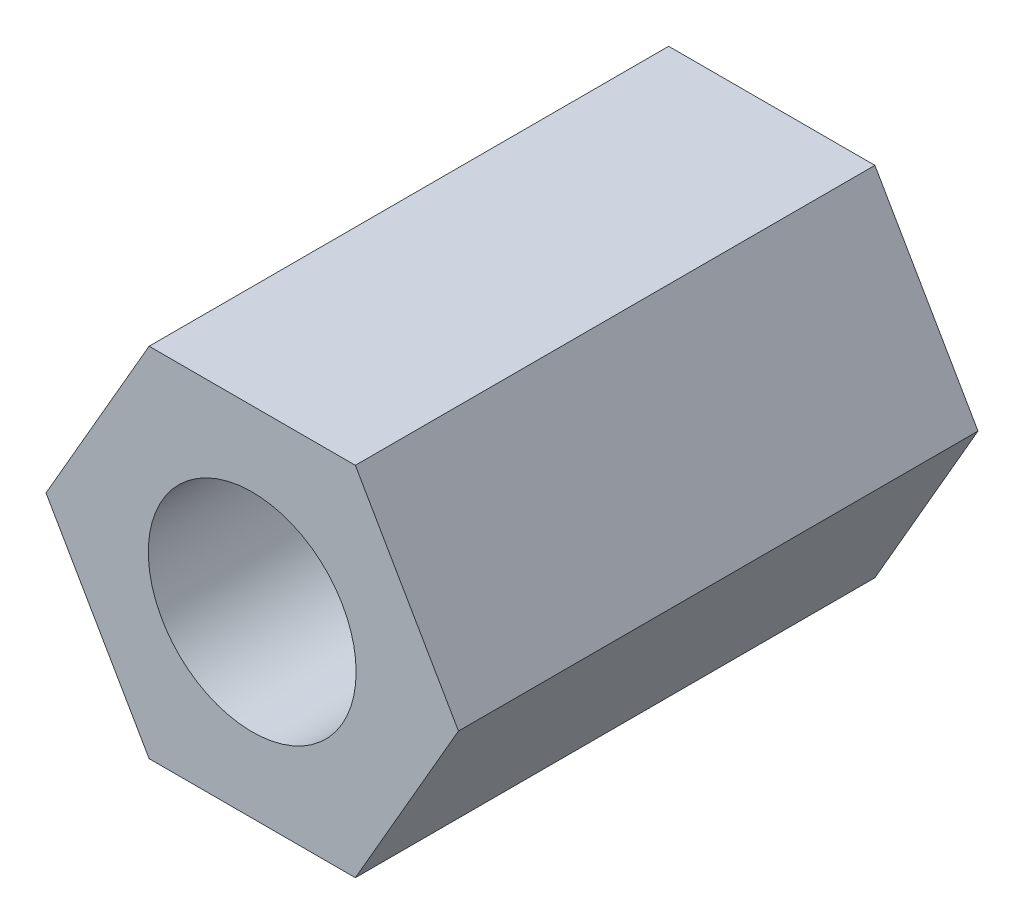
ISO-10303-21;
HEADER;
FILE_DESCRIPTION(('STEP AP214'),'2;1');
FILE_NAME('part.step','',(''),(''),'','','');
FILE_SCHEMA(('AUTOMOTIVE_DESIGN { 1 0 10303 214 1 1 1 1 }'));
ENDSEC;
DATA;
#1=APPLICATION_CONTEXT('core data for automotive mechanical design processes');
#2=APPLICATION_PROTOCOL_DEFINITION('international standard','automotive_design',2000,#1);
#3=PRODUCT_CONTEXT('',#1,'mechanical');
#4=PRODUCT('Part','Part','',(#3));
#5=PRODUCT_RELATED_PRODUCT_CATEGORY('part','',(#4));
#6=PRODUCT_DEFINITION_FORMATION('','',#4);
#7=PRODUCT_DEFINITION_CONTEXT('part definition',#1,'design');
#8=PRODUCT_DEFINITION('design','',#6,#7);
#9=PRODUCT_DEFINITION_SHAPE('','',#8);
#10=(LENGTH_UNIT() NAMED_UNIT(*) SI_UNIT(.MILLI.,.METRE.));
#11=(NAMED_UNIT(*) PLANE_ANGLE_UNIT() SI_UNIT($,.RADIAN.));
#12=(NAMED_UNIT(*) SI_UNIT($,.STERADIAN.) SOLID_ANGLE_UNIT());
#13=UNCERTAINTY_MEASURE_WITH_UNIT(LENGTH_MEASURE(1.E-05),#10,'distance_accuracy_value','');
#14=(GEOMETRIC_REPRESENTATION_CONTEXT(3) GLOBAL_UNCERTAINTY_ASSIGNED_CONTEXT((#13)) GLOBAL_UNIT_ASSIGNED_CONTEXT((#10,
#11,#12)) REPRESENTATION_CONTEXT('',''));
#15=CARTESIAN_POINT('',(0.,0.,0.));
#16=DIRECTION('',(0.,0.,1.));
#17=DIRECTION('',(1.,0.,0.));
#18=AXIS2_PLACEMENT_3D('',#15,#16,#17);
#19=CARTESIAN_POINT('',(0.,0.,-1.));
#20=DIRECTION('',(0.,0.,-1.));
#21=DIRECTION('',(1.,0.,0.));
#22=AXIS2_PLACEMENT_3D('',#19,#20,#21);
#23=CYLINDRICAL_SURFACE('',#22,1.6);
#24=CARTESIAN_POINT('',(0.,0.,0.));
#25=DIRECTION('',(0.,0.,-1.));
#26=DIRECTION('',(1.,0.,0.));
#27=AXIS2_PLACEMENT_3D('',#24,#25,#26);
#28=CIRCLE('',#27,1.6);
#29=CARTESIAN_POINT('',(1.6,0.,0.));
#30=VERTEX_POINT('',#29);
#31=EDGE_CURVE('E254',#30,#30,#28,.T.);
#32=ORIENTED_EDGE('',*,*,#31,.T.);
#33=DIRECTION('',(0.,0.,1.));
#34=VECTOR('',#33,1.);
#35=CARTESIAN_POINT('',(1.6,0.,-1.));
#36=LINE('',#35,#34);
#37=CARTESIAN_POINT('',(1.6,0.,8.));
#38=VERTEX_POINT('',#37);
#39=EDGE_CURVE('E9',#30,#38,#36,.T.);
#40=ORIENTED_EDGE('',*,*,#39,.T.);
#41=CARTESIAN_POINT('',(0.,0.,8.));
#42=DIRECTION('',(0.,0.,-1.));
#43=DIRECTION('',(1.,0.,0.));
#44=AXIS2_PLACEMENT_3D('',#41,#42,#43);
#45=CIRCLE('',#44,1.6);
#46=EDGE_CURVE('E160',#38,#38,#45,.T.);
#47=ORIENTED_EDGE('',*,*,#46,.F.);
#48=ORIENTED_EDGE('',*,*,#39,.F.);
#49=EDGE_LOOP('',(#32,#40,#47,#48));
#50=FACE_BOUND('',#49,.T.);
#51=ADVANCED_FACE('F15',(#50),#23,.F.);
#52=CARTESIAN_POINT('',(-3.175426480543,0.,0.));
#53=DIRECTION('',(0.866025403784329,0.50000000000019,0.));
#54=DIRECTION('',(0.,0.,-1.));
#55=AXIS2_PLACEMENT_3D('',#52,#53,#54);
#56=PLANE('',#55);
#57=DIRECTION('',(0.50000000000019,-0.866025403784329,0.));
#58=VECTOR('',#57,1.);
#59=CARTESIAN_POINT('',(-3.175426480543,0.,0.));
#60=LINE('',#59,#58);
#61=CARTESIAN_POINT('',(-3.175426480543,0.,0.));
#62=VERTEX_POINT('',#61);
#63=CARTESIAN_POINT('',(-1.587713240271,-2.75,0.));
#64=VERTEX_POINT('',#63);
#65=EDGE_CURVE('E113',#62,#64,#60,.T.);
#66=ORIENTED_EDGE('',*,*,#65,.T.);
#67=DIRECTION('',(0.,0.,1.));
#68=VECTOR('',#67,1.);
#69=CARTESIAN_POINT('',(-1.587713240271,-2.75,0.));
#70=LINE('',#69,#68);
#71=CARTESIAN_POINT('',(-1.587713240271,-2.75,8.));
#72=VERTEX_POINT('',#71);
#73=EDGE_CURVE('E112',#64,#72,#70,.T.);
#74=ORIENTED_EDGE('',*,*,#73,.T.);
#75=DIRECTION('',(0.50000000000019,-0.866025403784329,0.));
#76=VECTOR('',#75,1.);
#77=CARTESIAN_POINT('',(-3.175426480543,0.,8.));
#78=LINE('',#77,#76);
#79=CARTESIAN_POINT('',(-3.175426480543,0.,8.));
#80=VERTEX_POINT('',#79);
#81=EDGE_CURVE('E147',#80,#72,#78,.T.);
#82=ORIENTED_EDGE('',*,*,#81,.F.);
#83=DIRECTION('',(0.,0.,1.));
#84=VECTOR('',#83,1.);
#85=CARTESIAN_POINT('',(-3.175426480543,0.,0.));
#86=LINE('',#85,#84);
#87=EDGE_CURVE('E25',#62,#80,#86,.T.);
#88=ORIENTED_EDGE('',*,*,#87,.F.);
#89=EDGE_LOOP('',(#66,#74,#82,#88));
#90=FACE_BOUND('',#89,.T.);
#91=ADVANCED_FACE('F17',(#90),#56,.F.);
#92=CARTESIAN_POINT('',(-1.587713240271,2.75,0.));
#93=DIRECTION('',(0.866025403784329,-0.50000000000019,0.));
#94=DIRECTION('',(0.,0.,-1.));
#95=AXIS2_PLACEMENT_3D('',#92,#93,#94);
#96=PLANE('',#95);
#97=DIRECTION('',(-0.50000000000019,-0.866025403784329,0.));
#98=VECTOR('',#97,1.);
#99=CARTESIAN_POINT('',(-1.587713240271,2.75,0.));
#100=LINE('',#99,#98);
#101=CARTESIAN_POINT('',(-1.587713240271,2.75,0.));
#102=VERTEX_POINT('',#101);
#103=EDGE_CURVE('E79',#102,#62,#100,.T.);
#104=ORIENTED_EDGE('',*,*,#103,.T.);
#105=ORIENTED_EDGE('',*,*,#87,.T.);
#106=DIRECTION('',(-0.50000000000019,-0.866025403784329,0.));
#107=VECTOR('',#106,1.);
#108=CARTESIAN_POINT('',(-1.587713240271,2.75,8.));
#109=LINE('',#108,#107);
#110=CARTESIAN_POINT('',(-1.587713240271,2.75,8.));
#111=VERTEX_POINT('',#110);
#112=EDGE_CURVE('E70',#111,#80,#109,.T.);
#113=ORIENTED_EDGE('',*,*,#112,.F.);
#114=DIRECTION('',(0.,0.,1.));
#115=VECTOR('',#114,1.);
#116=CARTESIAN_POINT('',(-1.587713240271,2.75,0.));
#117=LINE('',#116,#115);
#118=EDGE_CURVE('E142',#102,#111,#117,.T.);
#119=ORIENTED_EDGE('',*,*,#118,.F.);
#120=EDGE_LOOP('',(#104,#105,#113,#119));
#121=FACE_BOUND('',#120,.T.);
#122=ADVANCED_FACE('F224',(#121),#96,.F.);
#123=CARTESIAN_POINT('',(-1.587713240271,-2.75,0.));
#124=DIRECTION('',(0.,1.,0.));
#125=DIRECTION('',(1.,0.,0.));
#126=AXIS2_PLACEMENT_3D('',#123,#124,#125);
#127=PLANE('',#126);
#128=DIRECTION('',(1.,0.,0.));
#129=VECTOR('',#128,1.);
#130=CARTESIAN_POINT('',(-1.587713240271,-2.75,0.));
#131=LINE('',#130,#129);
#132=CARTESIAN_POINT('',(1.587713240271,-2.75,0.));
#133=VERTEX_POINT('',#132);
#134=EDGE_CURVE('E106',#64,#133,#131,.T.);
#135=ORIENTED_EDGE('',*,*,#134,.T.);
#136=DIRECTION('',(0.,0.,1.));
#137=VECTOR('',#136,1.);
#138=CARTESIAN_POINT('',(1.587713240271,-2.75,0.));
#139=LINE('',#138,#137);
#140=CARTESIAN_POINT('',(1.587713240271,-2.75,8.));
#141=VERTEX_POINT('',#140);
#142=EDGE_CURVE('E109',#133,#141,#139,.T.);
#143=ORIENTED_EDGE('',*,*,#142,.T.);
#144=DIRECTION('',(1.,0.,0.));
#145=VECTOR('',#144,1.);
#146=CARTESIAN_POINT('',(-1.587713240271,-2.75,8.));
#147=LINE('',#146,#145);
#148=EDGE_CURVE('E152',#72,#141,#147,.T.);
#149=ORIENTED_EDGE('',*,*,#148,.F.);
#150=ORIENTED_EDGE('',*,*,#73,.F.);
#151=EDGE_LOOP('',(#135,#143,#149,#150));
#152=FACE_BOUND('',#151,.T.);
#153=ADVANCED_FACE('F107',(#152),#127,.F.);
#154=CARTESIAN_POINT('',(0.,0.,8.));
#155=DIRECTION('',(0.,0.,1.));
#156=DIRECTION('',(1.,0.,0.));
#157=AXIS2_PLACEMENT_3D('',#154,#155,#156);
#158=PLANE('',#157);
#159=ORIENTED_EDGE('',*,*,#46,.T.);
#160=EDGE_LOOP('',(#159));
#161=FACE_BOUND('',#160,.T.);
#162=DIRECTION('',(-0.50000000000019,0.866025403784329,0.));
#163=VECTOR('',#162,1.);
#164=CARTESIAN_POINT('',(3.175426480543,0.,8.));
#165=LINE('',#164,#163);
#166=CARTESIAN_POINT('',(3.175426480543,0.,8.));
#167=VERTEX_POINT('',#166);
#168=CARTESIAN_POINT('',(1.587713240271,2.75,8.));
#169=VERTEX_POINT('',#168);
#170=EDGE_CURVE('E138',#167,#169,#165,.T.);
#171=ORIENTED_EDGE('',*,*,#170,.T.);
#172=DIRECTION('',(-1.,0.,0.));
#173=VECTOR('',#172,1.);
#174=CARTESIAN_POINT('',(1.587713240271,2.75,8.));
#175=LINE('',#174,#173);
#176=EDGE_CURVE('E116',#169,#111,#175,.T.);
#177=ORIENTED_EDGE('',*,*,#176,.T.);
#178=ORIENTED_EDGE('',*,*,#112,.T.);
#179=ORIENTED_EDGE('',*,*,#81,.T.);
#180=ORIENTED_EDGE('',*,*,#148,.T.);
#181=DIRECTION('',(0.50000000000019,0.866025403784329,0.));
#182=VECTOR('',#181,1.);
#183=CARTESIAN_POINT('',(1.587713240271,-2.75,8.));
#184=LINE('',#183,#182);
#185=EDGE_CURVE('E97',#141,#167,#184,.T.);
#186=ORIENTED_EDGE('',*,*,#185,.T.);
#187=EDGE_LOOP('',(#171,#177,#178,#179,#180,#186));
#188=FACE_BOUND('',#187,.T.);
#189=ADVANCED_FACE('F206',(#161,#188),#158,.T.);
#190=CARTESIAN_POINT('',(0.,0.,0.));
#191=DIRECTION('',(0.,0.,1.));
#192=DIRECTION('',(1.,0.,0.));
#193=AXIS2_PLACEMENT_3D('',#190,#191,#192);
#194=PLANE('',#193);
#195=ORIENTED_EDGE('',*,*,#31,.F.);
#196=EDGE_LOOP('',(#195));
#197=FACE_BOUND('',#196,.T.);
#198=DIRECTION('',(0.50000000000019,0.866025403784329,0.));
#199=VECTOR('',#198,1.);
#200=CARTESIAN_POINT('',(1.587713240271,-2.75,0.));
#201=LINE('',#200,#199);
#202=CARTESIAN_POINT('',(3.175426480543,0.,0.));
#203=VERTEX_POINT('',#202);
#204=EDGE_CURVE('E121',#133,#203,#201,.T.);
#205=ORIENTED_EDGE('',*,*,#204,.F.);
#206=ORIENTED_EDGE('',*,*,#134,.F.);
#207=ORIENTED_EDGE('',*,*,#65,.F.);
#208=ORIENTED_EDGE('',*,*,#103,.F.);
#209=DIRECTION('',(-1.,0.,0.));
#210=VECTOR('',#209,1.);
#211=CARTESIAN_POINT('',(1.587713240271,2.75,0.));
#212=LINE('',#211,#210);
#213=CARTESIAN_POINT('',(1.587713240271,2.75,0.));
#214=VERTEX_POINT('',#213);
#215=EDGE_CURVE('E122',#214,#102,#212,.T.);
#216=ORIENTED_EDGE('',*,*,#215,.F.);
#217=DIRECTION('',(-0.50000000000019,0.866025403784329,0.));
#218=VECTOR('',#217,1.);
#219=CARTESIAN_POINT('',(3.175426480543,0.,0.));
#220=LINE('',#219,#218);
#221=EDGE_CURVE('E127',#203,#214,#220,.T.);
#222=ORIENTED_EDGE('',*,*,#221,.F.);
#223=EDGE_LOOP('',(#205,#206,#207,#208,#216,#222));
#224=FACE_BOUND('',#223,.T.);
#225=ADVANCED_FACE('F126',(#197,#224),#194,.F.);
#226=CARTESIAN_POINT('',(1.587713240271,2.75,0.));
#227=DIRECTION('',(0.,-1.,0.));
#228=DIRECTION('',(-1.,0.,0.));
#229=AXIS2_PLACEMENT_3D('',#226,#227,#228);
#230=PLANE('',#229);
#231=ORIENTED_EDGE('',*,*,#215,.T.);
#232=ORIENTED_EDGE('',*,*,#118,.T.);
#233=ORIENTED_EDGE('',*,*,#176,.F.);
#234=DIRECTION('',(0.,0.,1.));
#235=VECTOR('',#234,1.);
#236=CARTESIAN_POINT('',(1.587713240271,2.75,0.));
#237=LINE('',#236,#235);
#238=EDGE_CURVE('E262',#214,#169,#237,.T.);
#239=ORIENTED_EDGE('',*,*,#238,.F.);
#240=EDGE_LOOP('',(#231,#232,#233,#239));
#241=FACE_BOUND('',#240,.T.);
#242=ADVANCED_FACE('F189',(#241),#230,.F.);
#243=CARTESIAN_POINT('',(1.587713240271,-2.75,0.));
#244=DIRECTION('',(-0.866025403784329,0.50000000000019,0.));
#245=DIRECTION('',(0.,0.,1.));
#246=AXIS2_PLACEMENT_3D('',#243,#244,#245);
#247=PLANE('',#246);
#248=ORIENTED_EDGE('',*,*,#204,.T.);
#249=DIRECTION('',(0.,0.,1.));
#250=VECTOR('',#249,1.);
#251=CARTESIAN_POINT('',(3.175426480543,0.,0.));
#252=LINE('',#251,#250);
#253=EDGE_CURVE('E131',#203,#167,#252,.T.);
#254=ORIENTED_EDGE('',*,*,#253,.T.);
#255=ORIENTED_EDGE('',*,*,#185,.F.);
#256=ORIENTED_EDGE('',*,*,#142,.F.);
#257=EDGE_LOOP('',(#248,#254,#255,#256));
#258=FACE_BOUND('',#257,.T.);
#259=ADVANCED_FACE('F120',(#258),#247,.F.);
#260=CARTESIAN_POINT('',(3.175426480543,0.,0.));
#261=DIRECTION('',(-0.866025403784329,-0.50000000000019,0.));
#262=DIRECTION('',(-0.50000000000019,0.866025403784329,0.));
#263=AXIS2_PLACEMENT_3D('',#260,#261,#262);
#264=PLANE('',#263);
#265=ORIENTED_EDGE('',*,*,#221,.T.);
#266=ORIENTED_EDGE('',*,*,#238,.T.);
#267=ORIENTED_EDGE('',*,*,#170,.F.);
#268=ORIENTED_EDGE('',*,*,#253,.F.);
#269=EDGE_LOOP('',(#265,#266,#267,#268));
#270=FACE_BOUND('',#269,.T.);
#271=ADVANCED_FACE('F180',(#270),#264,.F.);
#272=CLOSED_SHELL('',(#51,#91,#122,#153,#189,#225,#242,#259,#271));
#273=MANIFOLD_SOLID_BREP('B1',#272);
#274=ADVANCED_BREP_SHAPE_REPRESENTATION('',(#18,#273),#14);
#275=SHAPE_DEFINITION_REPRESENTATION(#9,#274);
ENDSEC;
END-ISO-10303-21;
